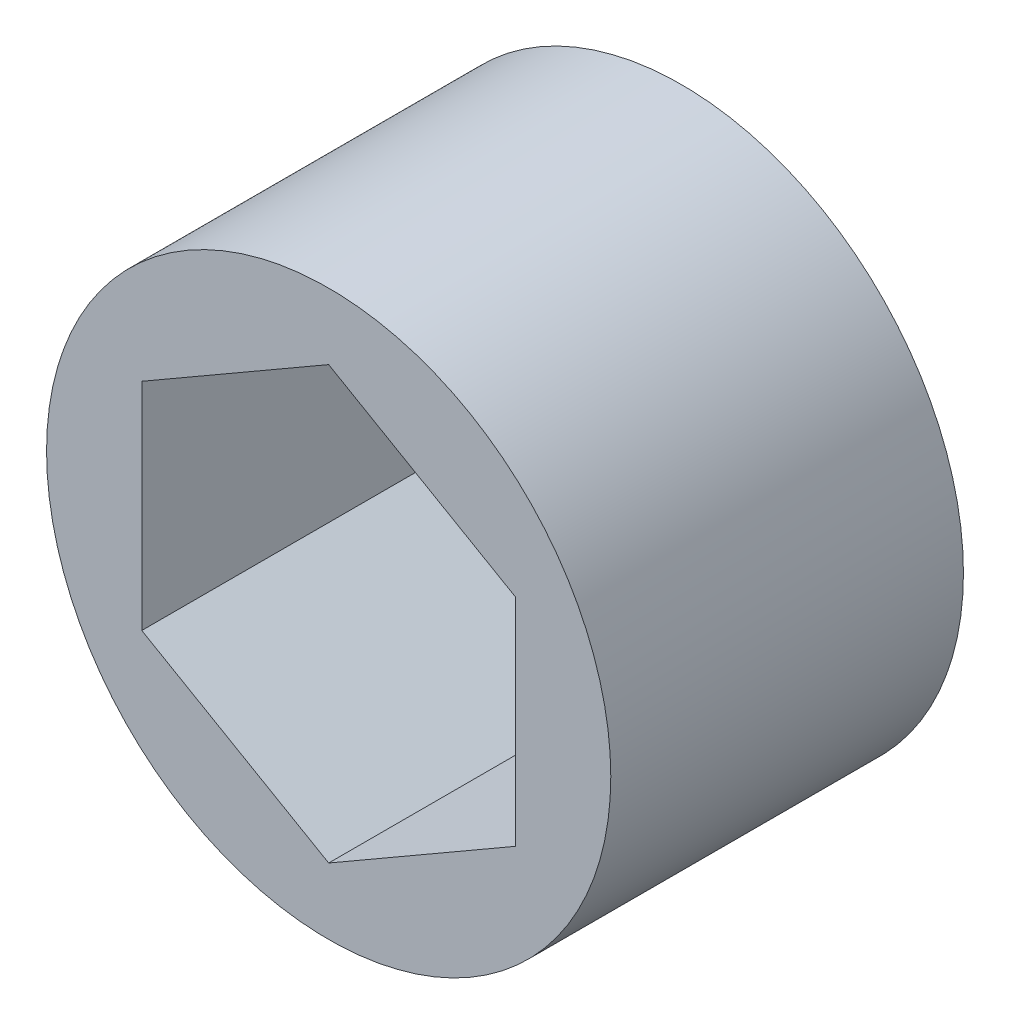
ISO-10303-21;
HEADER;
FILE_DESCRIPTION(('STEP AP214'),'2;1');
FILE_NAME('part.step','',(''),(''),'','','');
FILE_SCHEMA(('AUTOMOTIVE_DESIGN { 1 0 10303 214 1 1 1 1 }'));
ENDSEC;
DATA;
#1=APPLICATION_CONTEXT('core data for automotive mechanical design processes');
#2=APPLICATION_PROTOCOL_DEFINITION('international standard','automotive_design',2000,#1);
#3=PRODUCT_CONTEXT('',#1,'mechanical');
#4=PRODUCT('Part','Part','',(#3));
#5=PRODUCT_RELATED_PRODUCT_CATEGORY('part','',(#4));
#6=PRODUCT_DEFINITION_FORMATION('','',#4);
#7=PRODUCT_DEFINITION_CONTEXT('part definition',#1,'design');
#8=PRODUCT_DEFINITION('design','',#6,#7);
#9=PRODUCT_DEFINITION_SHAPE('','',#8);
#10=(LENGTH_UNIT() NAMED_UNIT(*) SI_UNIT(.MILLI.,.METRE.));
#11=(NAMED_UNIT(*) PLANE_ANGLE_UNIT() SI_UNIT($,.RADIAN.));
#12=(NAMED_UNIT(*) SI_UNIT($,.STERADIAN.) SOLID_ANGLE_UNIT());
#13=UNCERTAINTY_MEASURE_WITH_UNIT(LENGTH_MEASURE(1.E-05),#10,'distance_accuracy_value','');
#14=(GEOMETRIC_REPRESENTATION_CONTEXT(3) GLOBAL_UNCERTAINTY_ASSIGNED_CONTEXT((#13)) GLOBAL_UNIT_ASSIGNED_CONTEXT((#10,
#11,#12)) REPRESENTATION_CONTEXT('',''));
#15=CARTESIAN_POINT('',(0.,0.,0.));
#16=DIRECTION('',(0.,0.,1.));
#17=DIRECTION('',(1.,0.,0.));
#18=AXIS2_PLACEMENT_3D('',#15,#16,#17);
#19=CARTESIAN_POINT('',(0.,0.,6.35));
#20=DIRECTION('',(0.,0.,1.));
#21=DIRECTION('',(1.,0.,0.));
#22=AXIS2_PLACEMENT_3D('',#19,#20,#21);
#23=PLANE('',#22);
#24=CARTESIAN_POINT('',(0.,0.,6.35));
#25=DIRECTION('',(0.,0.,1.));
#26=DIRECTION('',(1.,0.,0.));
#27=AXIS2_PLACEMENT_3D('',#24,#25,#26);
#28=CIRCLE('',#27,10.16);
#29=CARTESIAN_POINT('',(10.16,0.,6.35));
#30=VERTEX_POINT('',#29);
#31=EDGE_CURVE('E11',#30,#30,#28,.T.);
#32=ORIENTED_EDGE('',*,*,#31,.T.);
#33=EDGE_LOOP('',(#32));
#34=FACE_BOUND('',#33,.T.);
#35=DIRECTION('',(-0.866025403784439,-0.5,0.));
#36=VECTOR('',#35,1.);
#37=CARTESIAN_POINT('',(0.,7.77228932383074,6.35));
#38=LINE('',#37,#36);
#39=CARTESIAN_POINT('',(0.,7.77228932383074,6.35));
#40=VERTEX_POINT('',#39);
#41=CARTESIAN_POINT('',(-6.731,3.88614466191537,6.35));
#42=VERTEX_POINT('',#41);
#43=EDGE_CURVE('E106',#40,#42,#38,.T.);
#44=ORIENTED_EDGE('',*,*,#43,.F.);
#45=DIRECTION('',(-0.866025403784439,0.5,0.));
#46=VECTOR('',#45,1.);
#47=CARTESIAN_POINT('',(6.731,3.88614466191538,6.35));
#48=LINE('',#47,#46);
#49=CARTESIAN_POINT('',(6.731,3.88614466191538,6.35));
#50=VERTEX_POINT('',#49);
#51=EDGE_CURVE('E97',#50,#40,#48,.T.);
#52=ORIENTED_EDGE('',*,*,#51,.F.);
#53=DIRECTION('',(0.,1.,0.));
#54=VECTOR('',#53,1.);
#55=CARTESIAN_POINT('',(6.731,-3.88614466191537,6.35));
#56=LINE('',#55,#54);
#57=CARTESIAN_POINT('',(6.731,-3.88614466191537,6.35));
#58=VERTEX_POINT('',#57);
#59=EDGE_CURVE('E131',#58,#50,#56,.T.);
#60=ORIENTED_EDGE('',*,*,#59,.F.);
#61=DIRECTION('',(0.866025403784439,0.5,0.));
#62=VECTOR('',#61,1.);
#63=CARTESIAN_POINT('',(0.,-7.77228932383074,6.35));
#64=LINE('',#63,#62);
#65=CARTESIAN_POINT('',(0.,-7.77228932383074,6.35));
#66=VERTEX_POINT('',#65);
#67=EDGE_CURVE('E128',#66,#58,#64,.T.);
#68=ORIENTED_EDGE('',*,*,#67,.F.);
#69=DIRECTION('',(0.866025403784439,-0.5,0.));
#70=VECTOR('',#69,1.);
#71=CARTESIAN_POINT('',(-6.731,-3.88614466191537,6.35));
#72=LINE('',#71,#70);
#73=CARTESIAN_POINT('',(-6.731,-3.88614466191537,6.35));
#74=VERTEX_POINT('',#73);
#75=EDGE_CURVE('E123',#74,#66,#72,.T.);
#76=ORIENTED_EDGE('',*,*,#75,.F.);
#77=DIRECTION('',(0.,-1.,0.));
#78=VECTOR('',#77,1.);
#79=CARTESIAN_POINT('',(-6.731,3.88614466191537,6.35));
#80=LINE('',#79,#78);
#81=EDGE_CURVE('E119',#42,#74,#80,.T.);
#82=ORIENTED_EDGE('',*,*,#81,.F.);
#83=EDGE_LOOP('',(#44,#52,#60,#68,#76,#82));
#84=FACE_BOUND('',#83,.T.);
#85=ADVANCED_FACE('F43',(#34,#84),#23,.T.);
#86=CARTESIAN_POINT('',(0.,0.,-6.35));
#87=DIRECTION('',(0.,0.,1.));
#88=DIRECTION('',(1.,0.,0.));
#89=AXIS2_PLACEMENT_3D('',#86,#87,#88);
#90=PLANE('',#89);
#91=CARTESIAN_POINT('',(0.,0.,-6.35));
#92=DIRECTION('',(0.,0.,1.));
#93=DIRECTION('',(1.,0.,0.));
#94=AXIS2_PLACEMENT_3D('',#91,#92,#93);
#95=CIRCLE('',#94,10.16);
#96=CARTESIAN_POINT('',(10.16,0.,-6.35));
#97=VERTEX_POINT('',#96);
#98=EDGE_CURVE('E47',#97,#97,#95,.T.);
#99=ORIENTED_EDGE('',*,*,#98,.F.);
#100=EDGE_LOOP('',(#99));
#101=FACE_BOUND('',#100,.T.);
#102=DIRECTION('',(-0.866025403784439,0.5,0.));
#103=VECTOR('',#102,1.);
#104=CARTESIAN_POINT('',(6.731,3.88614466191538,-6.35));
#105=LINE('',#104,#103);
#106=CARTESIAN_POINT('',(6.731,3.88614466191538,-6.35));
#107=VERTEX_POINT('',#106);
#108=CARTESIAN_POINT('',(0.,7.77228932383074,-6.35));
#109=VERTEX_POINT('',#108);
#110=EDGE_CURVE('E67',#107,#109,#105,.T.);
#111=ORIENTED_EDGE('',*,*,#110,.T.);
#112=DIRECTION('',(-0.866025403784439,-0.5,0.));
#113=VECTOR('',#112,1.);
#114=CARTESIAN_POINT('',(0.,7.77228932383074,-6.35));
#115=LINE('',#114,#113);
#116=CARTESIAN_POINT('',(-6.731,3.88614466191537,-6.35));
#117=VERTEX_POINT('',#116);
#118=EDGE_CURVE('E113',#109,#117,#115,.T.);
#119=ORIENTED_EDGE('',*,*,#118,.T.);
#120=DIRECTION('',(0.,-1.,0.));
#121=VECTOR('',#120,1.);
#122=CARTESIAN_POINT('',(-6.731,3.88614466191537,-6.35));
#123=LINE('',#122,#121);
#124=CARTESIAN_POINT('',(-6.731,-3.88614466191537,-6.35));
#125=VERTEX_POINT('',#124);
#126=EDGE_CURVE('E138',#117,#125,#123,.T.);
#127=ORIENTED_EDGE('',*,*,#126,.T.);
#128=DIRECTION('',(0.866025403784439,-0.5,0.));
#129=VECTOR('',#128,1.);
#130=CARTESIAN_POINT('',(-6.731,-3.88614466191537,-6.35));
#131=LINE('',#130,#129);
#132=CARTESIAN_POINT('',(0.,-7.77228932383074,-6.35));
#133=VERTEX_POINT('',#132);
#134=EDGE_CURVE('E142',#125,#133,#131,.T.);
#135=ORIENTED_EDGE('',*,*,#134,.T.);
#136=DIRECTION('',(0.866025403784439,0.5,0.));
#137=VECTOR('',#136,1.);
#138=CARTESIAN_POINT('',(0.,-7.77228932383074,-6.35));
#139=LINE('',#138,#137);
#140=CARTESIAN_POINT('',(6.731,-3.88614466191537,-6.35));
#141=VERTEX_POINT('',#140);
#142=EDGE_CURVE('E146',#133,#141,#139,.T.);
#143=ORIENTED_EDGE('',*,*,#142,.T.);
#144=DIRECTION('',(0.,1.,0.));
#145=VECTOR('',#144,1.);
#146=CARTESIAN_POINT('',(6.731,-3.88614466191537,-6.35));
#147=LINE('',#146,#145);
#148=EDGE_CURVE('E107',#141,#107,#147,.T.);
#149=ORIENTED_EDGE('',*,*,#148,.T.);
#150=EDGE_LOOP('',(#111,#119,#127,#135,#143,#149));
#151=FACE_BOUND('',#150,.T.);
#152=ADVANCED_FACE('F170',(#101,#151),#90,.F.);
#153=CARTESIAN_POINT('',(0.,0.,6.35));
#154=DIRECTION('',(0.,0.,-1.));
#155=DIRECTION('',(-1.,0.,0.));
#156=AXIS2_PLACEMENT_3D('',#153,#154,#155);
#157=CYLINDRICAL_SURFACE('',#156,10.16);
#158=ORIENTED_EDGE('',*,*,#31,.F.);
#159=EDGE_LOOP('',(#158));
#160=FACE_BOUND('',#159,.T.);
#161=ORIENTED_EDGE('',*,*,#98,.T.);
#162=EDGE_LOOP('',(#161));
#163=FACE_BOUND('',#162,.T.);
#164=ADVANCED_FACE('F45',(#160,#163),#157,.T.);
#165=CARTESIAN_POINT('',(6.731,3.88614466191538,6.35));
#166=DIRECTION('',(-0.5,-0.866025403784439,0.));
#167=DIRECTION('',(0.866025403784439,-0.5,0.));
#168=AXIS2_PLACEMENT_3D('',#165,#166,#167);
#169=PLANE('',#168);
#170=ORIENTED_EDGE('',*,*,#110,.F.);
#171=DIRECTION('',(0.,0.,-1.));
#172=VECTOR('',#171,1.);
#173=CARTESIAN_POINT('',(6.731,3.88614466191538,6.35));
#174=LINE('',#173,#172);
#175=EDGE_CURVE('E101',#50,#107,#174,.T.);
#176=ORIENTED_EDGE('',*,*,#175,.F.);
#177=ORIENTED_EDGE('',*,*,#51,.T.);
#178=DIRECTION('',(0.,0.,-1.));
#179=VECTOR('',#178,1.);
#180=CARTESIAN_POINT('',(0.,7.77228932383074,6.35));
#181=LINE('',#180,#179);
#182=EDGE_CURVE('E100',#40,#109,#181,.T.);
#183=ORIENTED_EDGE('',*,*,#182,.T.);
#184=EDGE_LOOP('',(#170,#176,#177,#183));
#185=FACE_BOUND('',#184,.T.);
#186=ADVANCED_FACE('F99',(#185),#169,.T.);
#187=CARTESIAN_POINT('',(0.,7.77228932383074,6.35));
#188=DIRECTION('',(0.5,-0.866025403784439,0.));
#189=DIRECTION('',(0.866025403784439,0.5,0.));
#190=AXIS2_PLACEMENT_3D('',#187,#188,#189);
#191=PLANE('',#190);
#192=ORIENTED_EDGE('',*,*,#118,.F.);
#193=ORIENTED_EDGE('',*,*,#182,.F.);
#194=ORIENTED_EDGE('',*,*,#43,.T.);
#195=DIRECTION('',(0.,0.,-1.));
#196=VECTOR('',#195,1.);
#197=CARTESIAN_POINT('',(-6.731,3.88614466191537,6.35));
#198=LINE('',#197,#196);
#199=EDGE_CURVE('E115',#42,#117,#198,.T.);
#200=ORIENTED_EDGE('',*,*,#199,.T.);
#201=EDGE_LOOP('',(#192,#193,#194,#200));
#202=FACE_BOUND('',#201,.T.);
#203=ADVANCED_FACE('F110',(#202),#191,.T.);
#204=CARTESIAN_POINT('',(-6.731,3.88614466191537,6.35));
#205=DIRECTION('',(1.,0.,0.));
#206=DIRECTION('',(0.,1.,0.));
#207=AXIS2_PLACEMENT_3D('',#204,#205,#206);
#208=PLANE('',#207);
#209=ORIENTED_EDGE('',*,*,#126,.F.);
#210=ORIENTED_EDGE('',*,*,#199,.F.);
#211=ORIENTED_EDGE('',*,*,#81,.T.);
#212=DIRECTION('',(0.,0.,-1.));
#213=VECTOR('',#212,1.);
#214=CARTESIAN_POINT('',(-6.731,-3.88614466191537,6.35));
#215=LINE('',#214,#213);
#216=EDGE_CURVE('E160',#74,#125,#215,.T.);
#217=ORIENTED_EDGE('',*,*,#216,.T.);
#218=EDGE_LOOP('',(#209,#210,#211,#217));
#219=FACE_BOUND('',#218,.T.);
#220=ADVANCED_FACE('F166',(#219),#208,.T.);
#221=CARTESIAN_POINT('',(-6.731,-3.88614466191537,6.35));
#222=DIRECTION('',(0.5,0.866025403784439,0.));
#223=DIRECTION('',(-0.866025403784439,0.5,0.));
#224=AXIS2_PLACEMENT_3D('',#221,#222,#223);
#225=PLANE('',#224);
#226=ORIENTED_EDGE('',*,*,#134,.F.);
#227=ORIENTED_EDGE('',*,*,#216,.F.);
#228=ORIENTED_EDGE('',*,*,#75,.T.);
#229=DIRECTION('',(0.,0.,-1.));
#230=VECTOR('',#229,1.);
#231=CARTESIAN_POINT('',(0.,-7.77228932383074,6.35));
#232=LINE('',#231,#230);
#233=EDGE_CURVE('E157',#66,#133,#232,.T.);
#234=ORIENTED_EDGE('',*,*,#233,.T.);
#235=EDGE_LOOP('',(#226,#227,#228,#234));
#236=FACE_BOUND('',#235,.T.);
#237=ADVANCED_FACE('F178',(#236),#225,.T.);
#238=CARTESIAN_POINT('',(0.,-7.77228932383074,6.35));
#239=DIRECTION('',(-0.5,0.866025403784439,0.));
#240=DIRECTION('',(-0.866025403784439,-0.5,0.));
#241=AXIS2_PLACEMENT_3D('',#238,#239,#240);
#242=PLANE('',#241);
#243=ORIENTED_EDGE('',*,*,#142,.F.);
#244=ORIENTED_EDGE('',*,*,#233,.F.);
#245=ORIENTED_EDGE('',*,*,#67,.T.);
#246=DIRECTION('',(0.,0.,-1.));
#247=VECTOR('',#246,1.);
#248=CARTESIAN_POINT('',(6.731,-3.88614466191537,6.35));
#249=LINE('',#248,#247);
#250=EDGE_CURVE('E59',#58,#141,#249,.T.);
#251=ORIENTED_EDGE('',*,*,#250,.T.);
#252=EDGE_LOOP('',(#243,#244,#245,#251));
#253=FACE_BOUND('',#252,.T.);
#254=ADVANCED_FACE('F176',(#253),#242,.T.);
#255=CARTESIAN_POINT('',(6.731,-3.88614466191537,6.35));
#256=DIRECTION('',(-1.,0.,0.));
#257=DIRECTION('',(0.,-1.,0.));
#258=AXIS2_PLACEMENT_3D('',#255,#256,#257);
#259=PLANE('',#258);
#260=ORIENTED_EDGE('',*,*,#148,.F.);
#261=ORIENTED_EDGE('',*,*,#250,.F.);
#262=ORIENTED_EDGE('',*,*,#59,.T.);
#263=ORIENTED_EDGE('',*,*,#175,.T.);
#264=EDGE_LOOP('',(#260,#261,#262,#263));
#265=FACE_BOUND('',#264,.T.);
#266=ADVANCED_FACE('F172',(#265),#259,.T.);
#267=CLOSED_SHELL('',(#85,#152,#164,#186,#203,#220,#237,#254,#266));
#268=MANIFOLD_SOLID_BREP('B2',#267);
#269=ADVANCED_BREP_SHAPE_REPRESENTATION('',(#18,#268),#14);
#270=SHAPE_DEFINITION_REPRESENTATION(#9,#269);
ENDSEC;
END-ISO-10303-21;
